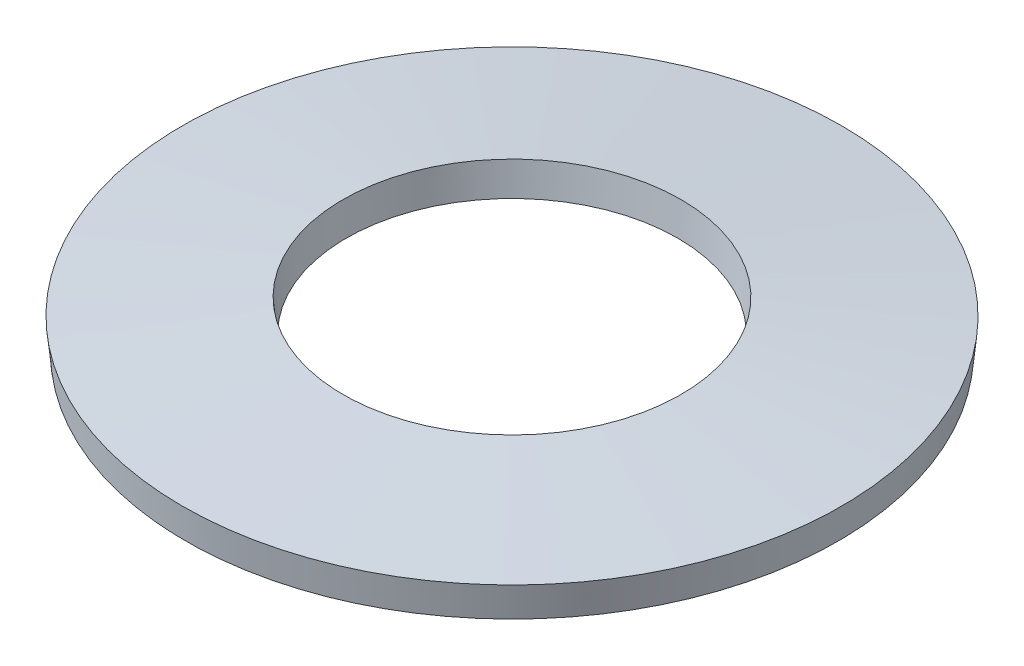
ISO-10303-21;
HEADER;
FILE_DESCRIPTION(('STEP AP214'),'2;1');
FILE_NAME('part.step','',(''),(''),'','','');
FILE_SCHEMA(('AUTOMOTIVE_DESIGN { 1 0 10303 214 1 1 1 1 }'));
ENDSEC;
DATA;
#1=APPLICATION_CONTEXT('core data for automotive mechanical design processes');
#2=APPLICATION_PROTOCOL_DEFINITION('international standard','automotive_design',2000,#1);
#3=PRODUCT_CONTEXT('',#1,'mechanical');
#4=PRODUCT('Part','Part','',(#3));
#5=PRODUCT_RELATED_PRODUCT_CATEGORY('part','',(#4));
#6=PRODUCT_DEFINITION_FORMATION('','',#4);
#7=PRODUCT_DEFINITION_CONTEXT('part definition',#1,'design');
#8=PRODUCT_DEFINITION('design','',#6,#7);
#9=PRODUCT_DEFINITION_SHAPE('','',#8);
#10=(LENGTH_UNIT() NAMED_UNIT(*) SI_UNIT(.MILLI.,.METRE.));
#11=(NAMED_UNIT(*) PLANE_ANGLE_UNIT() SI_UNIT($,.RADIAN.));
#12=(NAMED_UNIT(*) SI_UNIT($,.STERADIAN.) SOLID_ANGLE_UNIT());
#13=UNCERTAINTY_MEASURE_WITH_UNIT(LENGTH_MEASURE(1.E-05),#10,'distance_accuracy_value','');
#14=(GEOMETRIC_REPRESENTATION_CONTEXT(3) GLOBAL_UNCERTAINTY_ASSIGNED_CONTEXT((#13)) GLOBAL_UNIT_ASSIGNED_CONTEXT((#10,
#11,#12)) REPRESENTATION_CONTEXT('',''));
#15=CARTESIAN_POINT('',(0.,0.,0.));
#16=DIRECTION('',(0.,0.,1.));
#17=DIRECTION('',(1.,0.,0.));
#18=AXIS2_PLACEMENT_3D('',#15,#16,#17);
#19=CARTESIAN_POINT('',(0.,0.,0.));
#20=DIRECTION('',(0.,1.,0.));
#21=DIRECTION('',(0.,0.,1.));
#22=AXIS2_PLACEMENT_3D('',#19,#20,#21);
#23=CONICAL_SURFACE('',#22,22.0061860479838,0.101523990186738);
#24=CARTESIAN_POINT('',(0.,2.14788301692691,0.));
#25=DIRECTION('',(0.,-1.,0.));
#26=DIRECTION('',(0.,0.,-1.));
#27=AXIS2_PLACEMENT_3D('',#24,#25,#26);
#28=CIRCLE('',#27,22.225);
#29=CARTESIAN_POINT('',(0.,2.14788301692691,-22.225));
#30=VERTEX_POINT('',#29);
#31=EDGE_CURVE('E53',#30,#30,#28,.T.);
#32=ORIENTED_EDGE('',*,*,#31,.T.);
#33=EDGE_LOOP('',(#32));
#34=FACE_BOUND('',#33,.T.);
#35=CARTESIAN_POINT('',(0.,0.,0.));
#36=DIRECTION('',(0.,-1.,0.));
#37=DIRECTION('',(0.,0.,-1.));
#38=AXIS2_PLACEMENT_3D('',#35,#36,#37);
#39=CIRCLE('',#38,22.0061860479838);
#40=CARTESIAN_POINT('',(0.,0.,-22.0061860479838));
#41=VERTEX_POINT('',#40);
#42=EDGE_CURVE('E10',#41,#41,#39,.T.);
#43=ORIENTED_EDGE('',*,*,#42,.F.);
#44=EDGE_LOOP('',(#43));
#45=FACE_BOUND('',#44,.T.);
#46=ADVANCED_FACE('F36',(#34,#45),#23,.T.);
#47=CARTESIAN_POINT('',(0.,1.10331698307308,0.));
#48=DIRECTION('',(0.,-1.,0.));
#49=DIRECTION('',(0.,0.,-1.));
#50=AXIS2_PLACEMENT_3D('',#47,#48,#49);
#51=CONICAL_SURFACE('',#50,11.176,1.46927233660816);
#52=ORIENTED_EDGE('',*,*,#42,.T.);
#53=EDGE_LOOP('',(#52));
#54=FACE_BOUND('',#53,.T.);
#55=CARTESIAN_POINT('',(0.,1.10331698307308,0.));
#56=DIRECTION('',(0.,-1.,0.));
#57=DIRECTION('',(0.,0.,-1.));
#58=AXIS2_PLACEMENT_3D('',#55,#56,#57);
#59=CIRCLE('',#58,11.176);
#60=CARTESIAN_POINT('',(0.,1.10331698307308,-11.176));
#61=VERTEX_POINT('',#60);
#62=EDGE_CURVE('E43',#61,#61,#59,.T.);
#63=ORIENTED_EDGE('',*,*,#62,.F.);
#64=EDGE_LOOP('',(#63));
#65=FACE_BOUND('',#64,.T.);
#66=ADVANCED_FACE('F70',(#54,#65),#51,.F.);
#67=CARTESIAN_POINT('',(0.,3.2512,0.));
#68=DIRECTION('',(0.,1.,0.));
#69=DIRECTION('',(0.,0.,1.));
#70=AXIS2_PLACEMENT_3D('',#67,#68,#69);
#71=CONICAL_SURFACE('',#70,11.3948139520162,0.101523990186739);
#72=ORIENTED_EDGE('',*,*,#62,.T.);
#73=EDGE_LOOP('',(#72));
#74=FACE_BOUND('',#73,.T.);
#75=CARTESIAN_POINT('',(0.,3.2512,0.));
#76=DIRECTION('',(0.,-1.,0.));
#77=DIRECTION('',(0.,0.,-1.));
#78=AXIS2_PLACEMENT_3D('',#75,#76,#77);
#79=CIRCLE('',#78,11.3948139520162);
#80=CARTESIAN_POINT('',(0.,3.2512,-11.3948139520162));
#81=VERTEX_POINT('',#80);
#82=EDGE_CURVE('E49',#81,#81,#79,.T.);
#83=ORIENTED_EDGE('',*,*,#82,.F.);
#84=EDGE_LOOP('',(#83));
#85=FACE_BOUND('',#84,.T.);
#86=ADVANCED_FACE('F64',(#74,#85),#71,.F.);
#87=CARTESIAN_POINT('',(0.,2.14788301692691,0.));
#88=DIRECTION('',(0.,-1.,0.));
#89=DIRECTION('',(0.,0.,-1.));
#90=AXIS2_PLACEMENT_3D('',#87,#88,#89);
#91=CONICAL_SURFACE('',#90,22.225,1.46927233660816);
#92=ORIENTED_EDGE('',*,*,#82,.T.);
#93=EDGE_LOOP('',(#92));
#94=FACE_BOUND('',#93,.T.);
#95=ORIENTED_EDGE('',*,*,#31,.F.);
#96=EDGE_LOOP('',(#95));
#97=FACE_BOUND('',#96,.T.);
#98=ADVANCED_FACE('F62',(#94,#97),#91,.T.);
#99=CLOSED_SHELL('',(#46,#66,#86,#98));
#100=MANIFOLD_SOLID_BREP('B2',#99);
#101=ADVANCED_BREP_SHAPE_REPRESENTATION('',(#18,#100),#14);
#102=SHAPE_DEFINITION_REPRESENTATION(#9,#101);
ENDSEC;
END-ISO-10303-21;
